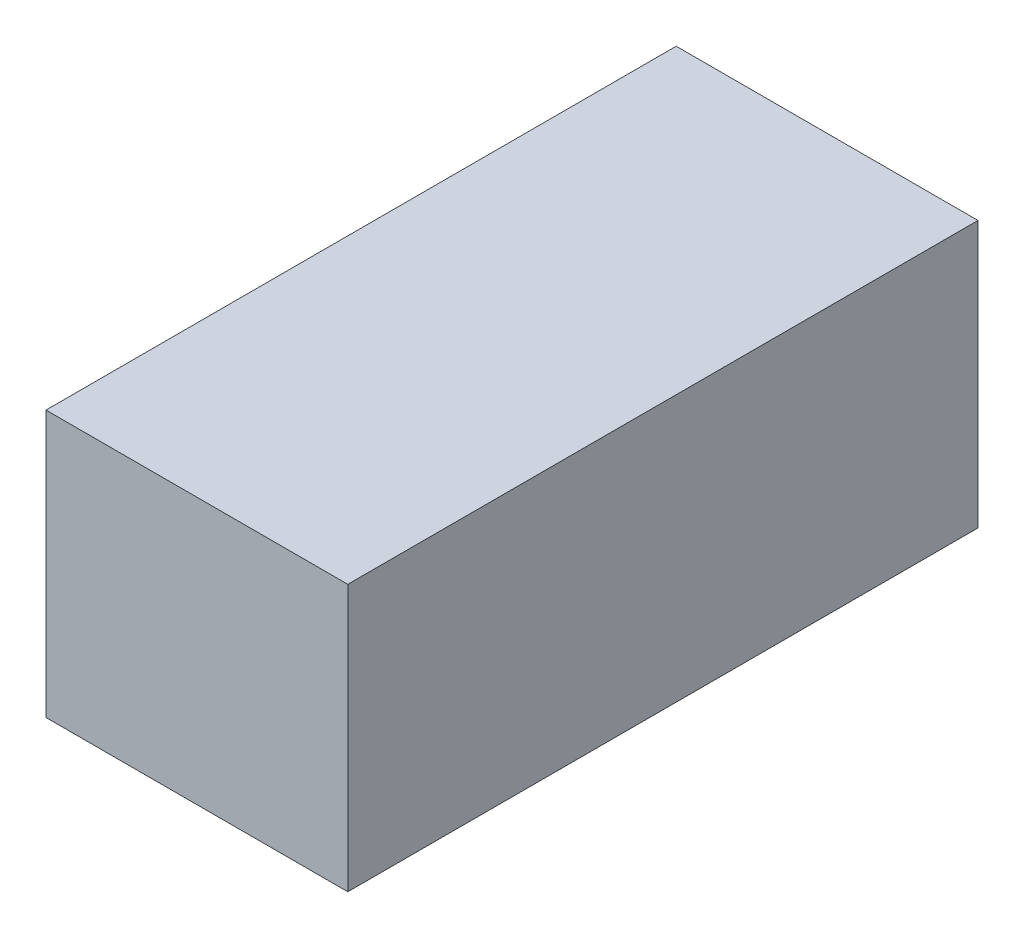
ISO-10303-21;
HEADER;
FILE_DESCRIPTION(('STEP AP214'),'2;1');
FILE_NAME('part.step','',(''),(''),'','','');
FILE_SCHEMA(('AUTOMOTIVE_DESIGN { 1 0 10303 214 1 1 1 1 }'));
ENDSEC;
DATA;
#1=APPLICATION_CONTEXT('core data for automotive mechanical design processes');
#2=APPLICATION_PROTOCOL_DEFINITION('international standard','automotive_design',2000,#1);
#3=PRODUCT_CONTEXT('',#1,'mechanical');
#4=PRODUCT('Part','Part','',(#3));
#5=PRODUCT_RELATED_PRODUCT_CATEGORY('part','',(#4));
#6=PRODUCT_DEFINITION_FORMATION('','',#4);
#7=PRODUCT_DEFINITION_CONTEXT('part definition',#1,'design');
#8=PRODUCT_DEFINITION('design','',#6,#7);
#9=PRODUCT_DEFINITION_SHAPE('','',#8);
#10=(LENGTH_UNIT() NAMED_UNIT(*) SI_UNIT(.MILLI.,.METRE.));
#11=(NAMED_UNIT(*) PLANE_ANGLE_UNIT() SI_UNIT($,.RADIAN.));
#12=(NAMED_UNIT(*) SI_UNIT($,.STERADIAN.) SOLID_ANGLE_UNIT());
#13=UNCERTAINTY_MEASURE_WITH_UNIT(LENGTH_MEASURE(1.E-05),#10,'distance_accuracy_value','');
#14=(GEOMETRIC_REPRESENTATION_CONTEXT(3) GLOBAL_UNCERTAINTY_ASSIGNED_CONTEXT((#13)) GLOBAL_UNIT_ASSIGNED_CONTEXT((#10,
#11,#12)) REPRESENTATION_CONTEXT('',''));
#15=CARTESIAN_POINT('',(0.,0.,0.));
#16=DIRECTION('',(0.,0.,1.));
#17=DIRECTION('',(1.,0.,0.));
#18=AXIS2_PLACEMENT_3D('',#15,#16,#17);
#19=CARTESIAN_POINT('',(0.,0.,71.));
#20=DIRECTION('',(1.,0.,0.));
#21=DIRECTION('',(0.,0.,-1.));
#22=AXIS2_PLACEMENT_3D('',#19,#20,#21);
#23=PLANE('',#22);
#24=DIRECTION('',(0.,-1.,0.));
#25=VECTOR('',#24,1.);
#26=CARTESIAN_POINT('',(0.,0.,0.));
#27=LINE('',#26,#25);
#28=CARTESIAN_POINT('',(0.,30.,0.));
#29=VERTEX_POINT('',#28);
#30=CARTESIAN_POINT('',(0.,0.,0.));
#31=VERTEX_POINT('',#30);
#32=EDGE_CURVE('E100',#29,#31,#27,.T.);
#33=ORIENTED_EDGE('',*,*,#32,.T.);
#34=DIRECTION('',(0.,0.,-1.));
#35=VECTOR('',#34,1.);
#36=CARTESIAN_POINT('',(0.,0.,71.));
#37=LINE('',#36,#35);
#38=CARTESIAN_POINT('',(0.,0.,71.));
#39=VERTEX_POINT('',#38);
#40=EDGE_CURVE('E11',#39,#31,#37,.T.);
#41=ORIENTED_EDGE('',*,*,#40,.F.);
#42=DIRECTION('',(0.,-1.,0.));
#43=VECTOR('',#42,1.);
#44=CARTESIAN_POINT('',(0.,0.,71.));
#45=LINE('',#44,#43);
#46=CARTESIAN_POINT('',(0.,30.,71.));
#47=VERTEX_POINT('',#46);
#48=EDGE_CURVE('E88',#47,#39,#45,.T.);
#49=ORIENTED_EDGE('',*,*,#48,.F.);
#50=DIRECTION('',(0.,0.,-1.));
#51=VECTOR('',#50,1.);
#52=CARTESIAN_POINT('',(0.,30.,71.));
#53=LINE('',#52,#51);
#54=EDGE_CURVE('E96',#47,#29,#53,.T.);
#55=ORIENTED_EDGE('',*,*,#54,.T.);
#56=EDGE_LOOP('',(#33,#41,#49,#55));
#57=FACE_BOUND('',#56,.T.);
#58=ADVANCED_FACE('F37',(#57),#23,.F.);
#59=CARTESIAN_POINT('',(0.,0.,71.));
#60=DIRECTION('',(0.,1.,0.));
#61=DIRECTION('',(0.,0.,1.));
#62=AXIS2_PLACEMENT_3D('',#59,#60,#61);
#63=PLANE('',#62);
#64=DIRECTION('',(1.,0.,0.));
#65=VECTOR('',#64,1.);
#66=CARTESIAN_POINT('',(0.,0.,0.));
#67=LINE('',#66,#65);
#68=CARTESIAN_POINT('',(34.,0.,0.));
#69=VERTEX_POINT('',#68);
#70=EDGE_CURVE('E92',#31,#69,#67,.T.);
#71=ORIENTED_EDGE('',*,*,#70,.T.);
#72=DIRECTION('',(0.,0.,-1.));
#73=VECTOR('',#72,1.);
#74=CARTESIAN_POINT('',(34.,0.,71.));
#75=LINE('',#74,#73);
#76=CARTESIAN_POINT('',(34.,0.,71.));
#77=VERTEX_POINT('',#76);
#78=EDGE_CURVE('E45',#77,#69,#75,.T.);
#79=ORIENTED_EDGE('',*,*,#78,.F.);
#80=DIRECTION('',(1.,0.,0.));
#81=VECTOR('',#80,1.);
#82=CARTESIAN_POINT('',(0.,0.,71.));
#83=LINE('',#82,#81);
#84=EDGE_CURVE('E83',#39,#77,#83,.T.);
#85=ORIENTED_EDGE('',*,*,#84,.F.);
#86=ORIENTED_EDGE('',*,*,#40,.T.);
#87=EDGE_LOOP('',(#71,#79,#85,#86));
#88=FACE_BOUND('',#87,.T.);
#89=ADVANCED_FACE('F91',(#88),#63,.F.);
#90=CARTESIAN_POINT('',(34.,0.,71.));
#91=DIRECTION('',(-1.,0.,0.));
#92=DIRECTION('',(0.,0.,1.));
#93=AXIS2_PLACEMENT_3D('',#90,#91,#92);
#94=PLANE('',#93);
#95=DIRECTION('',(0.,1.,0.));
#96=VECTOR('',#95,1.);
#97=CARTESIAN_POINT('',(34.,0.,0.));
#98=LINE('',#97,#96);
#99=CARTESIAN_POINT('',(34.,30.,0.));
#100=VERTEX_POINT('',#99);
#101=EDGE_CURVE('E70',#69,#100,#98,.T.);
#102=ORIENTED_EDGE('',*,*,#101,.T.);
#103=DIRECTION('',(0.,0.,-1.));
#104=VECTOR('',#103,1.);
#105=CARTESIAN_POINT('',(34.,30.,71.));
#106=LINE('',#105,#104);
#107=CARTESIAN_POINT('',(34.,30.,71.));
#108=VERTEX_POINT('',#107);
#109=EDGE_CURVE('E93',#108,#100,#106,.T.);
#110=ORIENTED_EDGE('',*,*,#109,.F.);
#111=DIRECTION('',(0.,1.,0.));
#112=VECTOR('',#111,1.);
#113=CARTESIAN_POINT('',(34.,0.,71.));
#114=LINE('',#113,#112);
#115=EDGE_CURVE('E86',#77,#108,#114,.T.);
#116=ORIENTED_EDGE('',*,*,#115,.F.);
#117=ORIENTED_EDGE('',*,*,#78,.T.);
#118=EDGE_LOOP('',(#102,#110,#116,#117));
#119=FACE_BOUND('',#118,.T.);
#120=ADVANCED_FACE('F94',(#119),#94,.F.);
#121=CARTESIAN_POINT('',(0.,30.,71.));
#122=DIRECTION('',(0.,-1.,0.));
#123=DIRECTION('',(0.,0.,-1.));
#124=AXIS2_PLACEMENT_3D('',#121,#122,#123);
#125=PLANE('',#124);
#126=DIRECTION('',(-1.,0.,0.));
#127=VECTOR('',#126,1.);
#128=CARTESIAN_POINT('',(0.,30.,0.));
#129=LINE('',#128,#127);
#130=EDGE_CURVE('E76',#100,#29,#129,.T.);
#131=ORIENTED_EDGE('',*,*,#130,.T.);
#132=ORIENTED_EDGE('',*,*,#54,.F.);
#133=DIRECTION('',(-1.,0.,0.));
#134=VECTOR('',#133,1.);
#135=CARTESIAN_POINT('',(0.,30.,71.));
#136=LINE('',#135,#134);
#137=EDGE_CURVE('E53',#108,#47,#136,.T.);
#138=ORIENTED_EDGE('',*,*,#137,.F.);
#139=ORIENTED_EDGE('',*,*,#109,.T.);
#140=EDGE_LOOP('',(#131,#132,#138,#139));
#141=FACE_BOUND('',#140,.T.);
#142=ADVANCED_FACE('F107',(#141),#125,.F.);
#143=CARTESIAN_POINT('',(0.,0.,71.));
#144=DIRECTION('',(0.,0.,-1.));
#145=DIRECTION('',(-1.,0.,0.));
#146=AXIS2_PLACEMENT_3D('',#143,#144,#145);
#147=PLANE('',#146);
#148=ORIENTED_EDGE('',*,*,#48,.T.);
#149=ORIENTED_EDGE('',*,*,#84,.T.);
#150=ORIENTED_EDGE('',*,*,#115,.T.);
#151=ORIENTED_EDGE('',*,*,#137,.T.);
#152=EDGE_LOOP('',(#148,#149,#150,#151));
#153=FACE_BOUND('',#152,.T.);
#154=ADVANCED_FACE('F84',(#153),#147,.F.);
#155=CARTESIAN_POINT('',(0.,0.,0.));
#156=DIRECTION('',(0.,0.,-1.));
#157=DIRECTION('',(-1.,0.,0.));
#158=AXIS2_PLACEMENT_3D('',#155,#156,#157);
#159=PLANE('',#158);
#160=ORIENTED_EDGE('',*,*,#32,.F.);
#161=ORIENTED_EDGE('',*,*,#130,.F.);
#162=ORIENTED_EDGE('',*,*,#101,.F.);
#163=ORIENTED_EDGE('',*,*,#70,.F.);
#164=EDGE_LOOP('',(#160,#161,#162,#163));
#165=FACE_BOUND('',#164,.T.);
#166=ADVANCED_FACE('F110',(#165),#159,.T.);
#167=CLOSED_SHELL('',(#58,#89,#120,#142,#154,#166));
#168=MANIFOLD_SOLID_BREP('B2',#167);
#169=ADVANCED_BREP_SHAPE_REPRESENTATION('',(#18,#168),#14);
#170=SHAPE_DEFINITION_REPRESENTATION(#9,#169);
ENDSEC;
END-ISO-10303-21;
